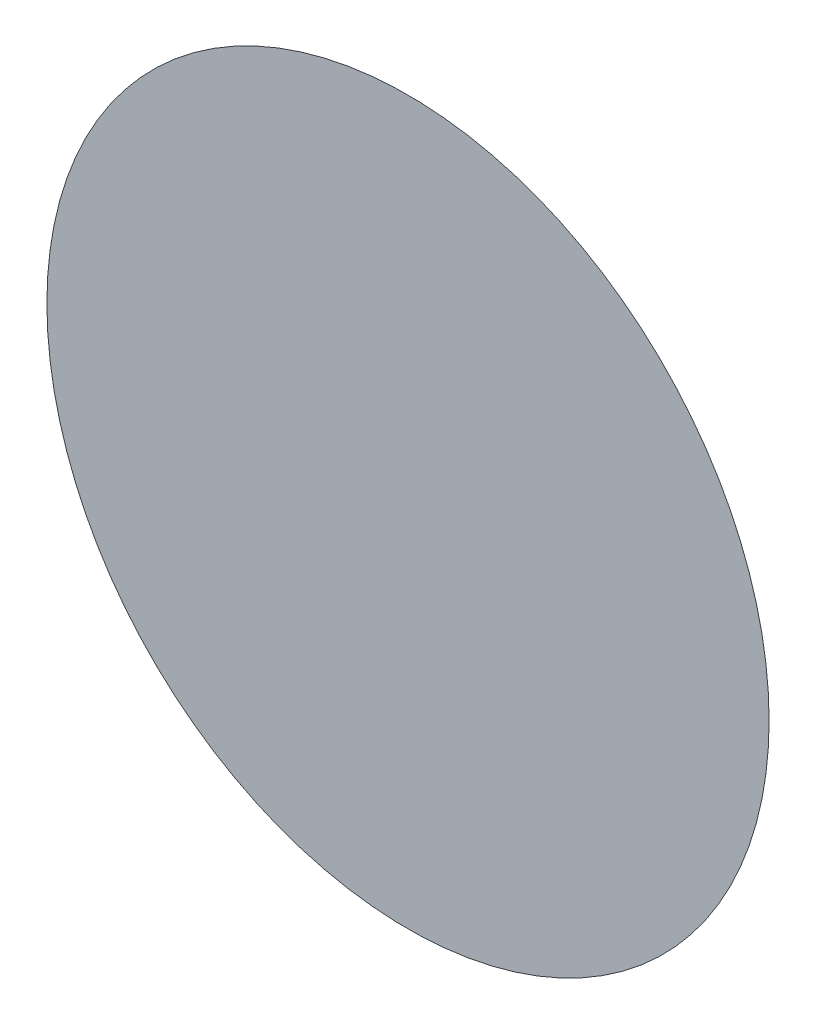
ISO-10303-21;
HEADER;
FILE_DESCRIPTION(('STEP AP214'),'2;1');
FILE_NAME('part.step','',(''),(''),'','','');
FILE_SCHEMA(('AUTOMOTIVE_DESIGN { 1 0 10303 214 1 1 1 1 }'));
ENDSEC;
DATA;
#1=APPLICATION_CONTEXT('core data for automotive mechanical design processes');
#2=APPLICATION_PROTOCOL_DEFINITION('international standard','automotive_design',2000,#1);
#3=PRODUCT_CONTEXT('',#1,'mechanical');
#4=PRODUCT('Part','Part','',(#3));
#5=PRODUCT_RELATED_PRODUCT_CATEGORY('part','',(#4));
#6=PRODUCT_DEFINITION_FORMATION('','',#4);
#7=PRODUCT_DEFINITION_CONTEXT('part definition',#1,'design');
#8=PRODUCT_DEFINITION('design','',#6,#7);
#9=PRODUCT_DEFINITION_SHAPE('','',#8);
#10=(LENGTH_UNIT() NAMED_UNIT(*) SI_UNIT(.MILLI.,.METRE.));
#11=(NAMED_UNIT(*) PLANE_ANGLE_UNIT() SI_UNIT($,.RADIAN.));
#12=(NAMED_UNIT(*) SI_UNIT($,.STERADIAN.) SOLID_ANGLE_UNIT());
#13=UNCERTAINTY_MEASURE_WITH_UNIT(LENGTH_MEASURE(1.E-05),#10,'distance_accuracy_value','');
#14=(GEOMETRIC_REPRESENTATION_CONTEXT(3) GLOBAL_UNCERTAINTY_ASSIGNED_CONTEXT((#13)) GLOBAL_UNIT_ASSIGNED_CONTEXT((#10,
#11,#12)) REPRESENTATION_CONTEXT('',''));
#15=CARTESIAN_POINT('',(0.,0.,0.));
#16=DIRECTION('',(0.,0.,1.));
#17=DIRECTION('',(1.,0.,0.));
#18=AXIS2_PLACEMENT_3D('',#15,#16,#17);
#19=CARTESIAN_POINT('',(0.,0.,-36.7330705183493));
#20=DIRECTION('',(0.,0.,1.));
#21=DIRECTION('',(1.,0.,0.));
#22=AXIS2_PLACEMENT_3D('',#19,#20,#21);
#23=CONICAL_SURFACE('',#22,100.,0.960070362405688);
#24=CARTESIAN_POINT('',(0.,0.,33.2669294816507));
#25=DIRECTION('',(0.,0.,-1.));
#26=DIRECTION('',(-1.,0.,0.));
#27=AXIS2_PLACEMENT_3D('',#24,#25,#26);
#28=CIRCLE('',#27,200.);
#29=CARTESIAN_POINT('',(-200.,0.,33.2669294816507));
#30=VERTEX_POINT('',#29);
#31=EDGE_CURVE('E46',#30,#30,#28,.T.);
#32=ORIENTED_EDGE('',*,*,#31,.T.);
#33=EDGE_LOOP('',(#32));
#34=FACE_BOUND('',#33,.T.);
#35=CARTESIAN_POINT('',(0.,0.,-36.7330705183493));
#36=DIRECTION('',(0.,0.,-1.));
#37=DIRECTION('',(-1.,0.,0.));
#38=AXIS2_PLACEMENT_3D('',#35,#36,#37);
#39=CIRCLE('',#38,100.);
#40=CARTESIAN_POINT('',(-100.,0.,-36.7330705183493));
#41=VERTEX_POINT('',#40);
#42=EDGE_CURVE('E11',#41,#41,#39,.T.);
#43=ORIENTED_EDGE('',*,*,#42,.F.);
#44=EDGE_LOOP('',(#43));
#45=FACE_BOUND('',#44,.T.);
#46=ADVANCED_FACE('F39',(#34,#45),#23,.T.);
#47=CARTESIAN_POINT('',(-100.,0.,-36.7330705183493));
#48=DIRECTION('',(0.,0.,-1.));
#49=DIRECTION('',(-1.,0.,0.));
#50=AXIS2_PLACEMENT_3D('',#47,#48,#49);
#51=PLANE('',#50);
#52=CARTESIAN_POINT('',(0.,0.,-36.7330705183493));
#53=DIRECTION('',(0.,0.,-1.));
#54=DIRECTION('',(1.,0.,0.));
#55=AXIS2_PLACEMENT_3D('',#52,#53,#54);
#56=CIRCLE('',#55,48.25);
#57=CARTESIAN_POINT('',(-46.25,13.7477270848675,-36.7330705183493));
#58=VERTEX_POINT('',#57);
#59=CARTESIAN_POINT('',(46.25,13.7477270848675,-36.7330705183493));
#60=VERTEX_POINT('',#59);
#61=EDGE_CURVE('E53',#58,#60,#56,.T.);
#62=ORIENTED_EDGE('',*,*,#61,.F.);
#63=DIRECTION('',(0.,1.,0.));
#64=VECTOR('',#63,1.);
#65=CARTESIAN_POINT('',(-46.25,13.7477270848675,-36.7330705183493));
#66=LINE('',#65,#64);
#67=CARTESIAN_POINT('',(-46.25,-16.0466901128784,-36.7330705183493));
#68=VERTEX_POINT('',#67);
#69=EDGE_CURVE('E104',#68,#58,#66,.T.);
#70=ORIENTED_EDGE('',*,*,#69,.F.);
#71=CARTESIAN_POINT('',(0.,0.,-36.7330705183493));
#72=DIRECTION('',(0.,0.,-1.));
#73=DIRECTION('',(-1.,0.,0.));
#74=AXIS2_PLACEMENT_3D('',#71,#72,#73);
#75=CIRCLE('',#74,48.9546602845812);
#76=CARTESIAN_POINT('',(46.25,-16.0466901128784,-36.7330705183493));
#77=VERTEX_POINT('',#76);
#78=EDGE_CURVE('E110',#77,#68,#75,.T.);
#79=ORIENTED_EDGE('',*,*,#78,.F.);
#80=DIRECTION('',(0.,-1.,0.));
#81=VECTOR('',#80,1.);
#82=CARTESIAN_POINT('',(46.25,13.7477270848675,-36.7330705183493));
#83=LINE('',#82,#81);
#84=EDGE_CURVE('E88',#60,#77,#83,.T.);
#85=ORIENTED_EDGE('',*,*,#84,.F.);
#86=EDGE_LOOP('',(#62,#70,#79,#85));
#87=FACE_BOUND('',#86,.T.);
#88=ORIENTED_EDGE('',*,*,#42,.T.);
#89=EDGE_LOOP('',(#88));
#90=FACE_BOUND('',#89,.T.);
#91=ADVANCED_FACE('F123',(#87,#90),#51,.T.);
#92=CARTESIAN_POINT('',(0.,0.,33.2669294816507));
#93=DIRECTION('',(0.,0.,1.));
#94=DIRECTION('',(1.,0.,0.));
#95=AXIS2_PLACEMENT_3D('',#92,#93,#94);
#96=PLANE('',#95);
#97=ORIENTED_EDGE('',*,*,#31,.F.);
#98=EDGE_LOOP('',(#97));
#99=FACE_BOUND('',#98,.T.);
#100=ADVANCED_FACE('F120',(#99),#96,.T.);
#101=CARTESIAN_POINT('',(0.,0.,-2.4330705183493));
#102=DIRECTION('',(0.,0.,-1.));
#103=DIRECTION('',(-1.,0.,0.));
#104=AXIS2_PLACEMENT_3D('',#101,#102,#103);
#105=CYLINDRICAL_SURFACE('',#104,48.25);
#106=ORIENTED_EDGE('',*,*,#61,.T.);
#107=DIRECTION('',(0.,0.,-1.));
#108=VECTOR('',#107,1.);
#109=CARTESIAN_POINT('',(46.25,13.7477270848675,-2.4330705183493));
#110=LINE('',#109,#108);
#111=CARTESIAN_POINT('',(46.25,13.7477270848675,-2.4330705183493));
#112=VERTEX_POINT('',#111);
#113=EDGE_CURVE('E76',#112,#60,#110,.T.);
#114=ORIENTED_EDGE('',*,*,#113,.F.);
#115=CARTESIAN_POINT('',(0.,0.,-2.4330705183493));
#116=DIRECTION('',(0.,0.,-1.));
#117=DIRECTION('',(1.,0.,0.));
#118=AXIS2_PLACEMENT_3D('',#115,#116,#117);
#119=CIRCLE('',#118,48.25);
#120=CARTESIAN_POINT('',(-46.25,13.7477270848675,-2.4330705183493));
#121=VERTEX_POINT('',#120);
#122=EDGE_CURVE('E102',#121,#112,#119,.T.);
#123=ORIENTED_EDGE('',*,*,#122,.F.);
#124=DIRECTION('',(0.,0.,-1.));
#125=VECTOR('',#124,1.);
#126=CARTESIAN_POINT('',(-46.25,13.7477270848675,-2.4330705183493));
#127=LINE('',#126,#125);
#128=EDGE_CURVE('E61',#121,#58,#127,.T.);
#129=ORIENTED_EDGE('',*,*,#128,.T.);
#130=EDGE_LOOP('',(#106,#114,#123,#129));
#131=FACE_BOUND('',#130,.T.);
#132=ADVANCED_FACE('F122',(#131),#105,.F.);
#133=CARTESIAN_POINT('',(-46.25,13.7477270848675,-2.4330705183493));
#134=DIRECTION('',(-1.,0.,0.));
#135=DIRECTION('',(0.,0.,1.));
#136=AXIS2_PLACEMENT_3D('',#133,#134,#135);
#137=PLANE('',#136);
#138=ORIENTED_EDGE('',*,*,#69,.T.);
#139=ORIENTED_EDGE('',*,*,#128,.F.);
#140=DIRECTION('',(0.,1.,0.));
#141=VECTOR('',#140,1.);
#142=CARTESIAN_POINT('',(-46.25,13.7477270848675,-2.4330705183493));
#143=LINE('',#142,#141);
#144=CARTESIAN_POINT('',(-46.25,-16.0466901128784,-2.4330705183493));
#145=VERTEX_POINT('',#144);
#146=EDGE_CURVE('E99',#145,#121,#143,.T.);
#147=ORIENTED_EDGE('',*,*,#146,.F.);
#148=DIRECTION('',(0.,0.,-1.));
#149=VECTOR('',#148,1.);
#150=CARTESIAN_POINT('',(-46.25,-16.0466901128784,-2.4330705183493));
#151=LINE('',#150,#149);
#152=EDGE_CURVE('E92',#145,#68,#151,.T.);
#153=ORIENTED_EDGE('',*,*,#152,.T.);
#154=EDGE_LOOP('',(#138,#139,#147,#153));
#155=FACE_BOUND('',#154,.T.);
#156=ADVANCED_FACE('F130',(#155),#137,.F.);
#157=CARTESIAN_POINT('',(0.,0.,-2.4330705183493));
#158=DIRECTION('',(0.,0.,-1.));
#159=DIRECTION('',(-1.,0.,0.));
#160=AXIS2_PLACEMENT_3D('',#157,#158,#159);
#161=CYLINDRICAL_SURFACE('',#160,48.9546602845812);
#162=ORIENTED_EDGE('',*,*,#78,.T.);
#163=ORIENTED_EDGE('',*,*,#152,.F.);
#164=CARTESIAN_POINT('',(0.,0.,-2.4330705183493));
#165=DIRECTION('',(0.,0.,-1.));
#166=DIRECTION('',(-1.,0.,0.));
#167=AXIS2_PLACEMENT_3D('',#164,#165,#166);
#168=CIRCLE('',#167,48.9546602845812);
#169=CARTESIAN_POINT('',(46.25,-16.0466901128784,-2.4330705183493));
#170=VERTEX_POINT('',#169);
#171=EDGE_CURVE('E95',#170,#145,#168,.T.);
#172=ORIENTED_EDGE('',*,*,#171,.F.);
#173=DIRECTION('',(0.,0.,-1.));
#174=VECTOR('',#173,1.);
#175=CARTESIAN_POINT('',(46.25,-16.0466901128784,-2.4330705183493));
#176=LINE('',#175,#174);
#177=EDGE_CURVE('E81',#170,#77,#176,.T.);
#178=ORIENTED_EDGE('',*,*,#177,.T.);
#179=EDGE_LOOP('',(#162,#163,#172,#178));
#180=FACE_BOUND('',#179,.T.);
#181=ADVANCED_FACE('F96',(#180),#161,.F.);
#182=CARTESIAN_POINT('',(46.25,13.7477270848675,-2.4330705183493));
#183=DIRECTION('',(1.,0.,0.));
#184=DIRECTION('',(0.,0.,-1.));
#185=AXIS2_PLACEMENT_3D('',#182,#183,#184);
#186=PLANE('',#185);
#187=ORIENTED_EDGE('',*,*,#84,.T.);
#188=ORIENTED_EDGE('',*,*,#177,.F.);
#189=DIRECTION('',(0.,-1.,0.));
#190=VECTOR('',#189,1.);
#191=CARTESIAN_POINT('',(46.25,13.7477270848675,-2.4330705183493));
#192=LINE('',#191,#190);
#193=EDGE_CURVE('E85',#112,#170,#192,.T.);
#194=ORIENTED_EDGE('',*,*,#193,.F.);
#195=ORIENTED_EDGE('',*,*,#113,.T.);
#196=EDGE_LOOP('',(#187,#188,#194,#195));
#197=FACE_BOUND('',#196,.T.);
#198=ADVANCED_FACE('F83',(#197),#186,.F.);
#199=CARTESIAN_POINT('',(0.,0.,-2.4330705183493));
#200=DIRECTION('',(0.,0.,1.));
#201=DIRECTION('',(1.,0.,0.));
#202=AXIS2_PLACEMENT_3D('',#199,#200,#201);
#203=PLANE('',#202);
#204=ORIENTED_EDGE('',*,*,#122,.T.);
#205=ORIENTED_EDGE('',*,*,#193,.T.);
#206=ORIENTED_EDGE('',*,*,#171,.T.);
#207=ORIENTED_EDGE('',*,*,#146,.T.);
#208=EDGE_LOOP('',(#204,#205,#206,#207));
#209=FACE_BOUND('',#208,.T.);
#210=ADVANCED_FACE('F101',(#209),#203,.F.);
#211=CLOSED_SHELL('',(#46,#91,#100,#132,#156,#181,#198,#210));
#212=MANIFOLD_SOLID_BREP('B2',#211);
#213=ADVANCED_BREP_SHAPE_REPRESENTATION('',(#18,#212),#14);
#214=SHAPE_DEFINITION_REPRESENTATION(#9,#213);
ENDSEC;
END-ISO-10303-21;
